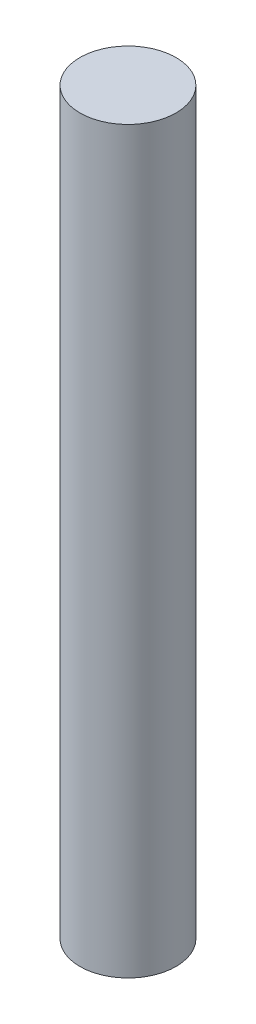
ISO-10303-21;
HEADER;
FILE_DESCRIPTION(('STEP AP214'),'2;1');
FILE_NAME('part.step','',(''),(''),'','','');
FILE_SCHEMA(('AUTOMOTIVE_DESIGN { 1 0 10303 214 1 1 1 1 }'));
ENDSEC;
DATA;
#1=APPLICATION_CONTEXT('core data for automotive mechanical design processes');
#2=APPLICATION_PROTOCOL_DEFINITION('international standard','automotive_design',2000,#1);
#3=PRODUCT_CONTEXT('',#1,'mechanical');
#4=PRODUCT('Part','Part','',(#3));
#5=PRODUCT_RELATED_PRODUCT_CATEGORY('part','',(#4));
#6=PRODUCT_DEFINITION_FORMATION('','',#4);
#7=PRODUCT_DEFINITION_CONTEXT('part definition',#1,'design');
#8=PRODUCT_DEFINITION('design','',#6,#7);
#9=PRODUCT_DEFINITION_SHAPE('','',#8);
#10=(LENGTH_UNIT() NAMED_UNIT(*) SI_UNIT(.MILLI.,.METRE.));
#11=(NAMED_UNIT(*) PLANE_ANGLE_UNIT() SI_UNIT($,.RADIAN.));
#12=(NAMED_UNIT(*) SI_UNIT($,.STERADIAN.) SOLID_ANGLE_UNIT());
#13=UNCERTAINTY_MEASURE_WITH_UNIT(LENGTH_MEASURE(1.E-05),#10,'distance_accuracy_value','');
#14=(GEOMETRIC_REPRESENTATION_CONTEXT(3) GLOBAL_UNCERTAINTY_ASSIGNED_CONTEXT((#13)) GLOBAL_UNIT_ASSIGNED_CONTEXT((#10,
#11,#12)) REPRESENTATION_CONTEXT('',''));
#15=CARTESIAN_POINT('',(0.,0.,0.));
#16=DIRECTION('',(0.,0.,1.));
#17=DIRECTION('',(1.,0.,0.));
#18=AXIS2_PLACEMENT_3D('',#15,#16,#17);
#19=CARTESIAN_POINT('',(0.,50.,0.));
#20=DIRECTION('',(0.,-1.,0.));
#21=DIRECTION('',(0.,0.,-1.));
#22=AXIS2_PLACEMENT_3D('',#19,#20,#21);
#23=CYLINDRICAL_SURFACE('',#22,3.25);
#24=CARTESIAN_POINT('',(0.,50.,0.));
#25=DIRECTION('',(0.,1.,0.));
#26=DIRECTION('',(0.,0.,1.));
#27=AXIS2_PLACEMENT_3D('',#24,#25,#26);
#28=CIRCLE('',#27,3.25);
#29=CARTESIAN_POINT('',(0.,50.,3.25));
#30=VERTEX_POINT('',#29);
#31=EDGE_CURVE('E10',#30,#30,#28,.T.);
#32=ORIENTED_EDGE('',*,*,#31,.F.);
#33=EDGE_LOOP('',(#32));
#34=FACE_BOUND('',#33,.T.);
#35=CARTESIAN_POINT('',(0.,0.,0.));
#36=DIRECTION('',(0.,1.,0.));
#37=DIRECTION('',(0.,0.,1.));
#38=AXIS2_PLACEMENT_3D('',#35,#36,#37);
#39=CIRCLE('',#38,3.25);
#40=CARTESIAN_POINT('',(0.,0.,3.25));
#41=VERTEX_POINT('',#40);
#42=EDGE_CURVE('E37',#41,#41,#39,.T.);
#43=ORIENTED_EDGE('',*,*,#42,.T.);
#44=EDGE_LOOP('',(#43));
#45=FACE_BOUND('',#44,.T.);
#46=ADVANCED_FACE('F34',(#34,#45),#23,.T.);
#47=CARTESIAN_POINT('',(0.,50.,0.));
#48=DIRECTION('',(0.,1.,0.));
#49=DIRECTION('',(0.,0.,1.));
#50=AXIS2_PLACEMENT_3D('',#47,#48,#49);
#51=PLANE('',#50);
#52=ORIENTED_EDGE('',*,*,#31,.T.);
#53=EDGE_LOOP('',(#52));
#54=FACE_BOUND('',#53,.T.);
#55=ADVANCED_FACE('F49',(#54),#51,.T.);
#56=CARTESIAN_POINT('',(0.,0.,0.));
#57=DIRECTION('',(0.,1.,0.));
#58=DIRECTION('',(0.,0.,1.));
#59=AXIS2_PLACEMENT_3D('',#56,#57,#58);
#60=PLANE('',#59);
#61=ORIENTED_EDGE('',*,*,#42,.F.);
#62=EDGE_LOOP('',(#61));
#63=FACE_BOUND('',#62,.T.);
#64=ADVANCED_FACE('F47',(#63),#60,.F.);
#65=CLOSED_SHELL('',(#46,#55,#64));
#66=MANIFOLD_SOLID_BREP('B2',#65);
#67=ADVANCED_BREP_SHAPE_REPRESENTATION('',(#18,#66),#14);
#68=SHAPE_DEFINITION_REPRESENTATION(#9,#67);
ENDSEC;
END-ISO-10303-21;
